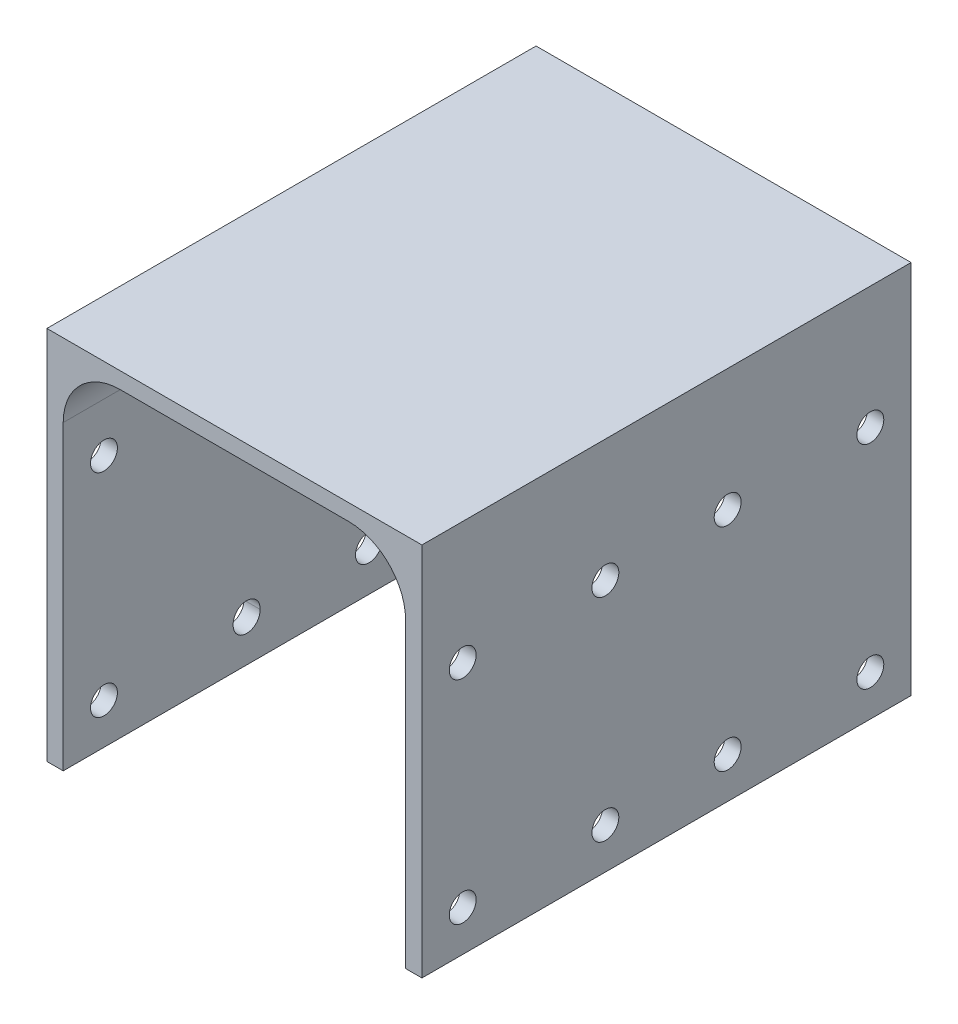
ISO-10303-21;
HEADER;
FILE_DESCRIPTION(('STEP AP214'),'2;1');
FILE_NAME('part.step','',(''),(''),'','','');
FILE_SCHEMA(('AUTOMOTIVE_DESIGN { 1 0 10303 214 1 1 1 1 }'));
ENDSEC;
DATA;
#1=APPLICATION_CONTEXT('core data for automotive mechanical design processes');
#2=APPLICATION_PROTOCOL_DEFINITION('international standard','automotive_design',2000,#1);
#3=PRODUCT_CONTEXT('',#1,'mechanical');
#4=PRODUCT('Part','Part','',(#3));
#5=PRODUCT_RELATED_PRODUCT_CATEGORY('part','',(#4));
#6=PRODUCT_DEFINITION_FORMATION('','',#4);
#7=PRODUCT_DEFINITION_CONTEXT('part definition',#1,'design');
#8=PRODUCT_DEFINITION('design','',#6,#7);
#9=PRODUCT_DEFINITION_SHAPE('','',#8);
#10=(LENGTH_UNIT() NAMED_UNIT(*) SI_UNIT(.MILLI.,.METRE.));
#11=(NAMED_UNIT(*) PLANE_ANGLE_UNIT() SI_UNIT($,.RADIAN.));
#12=(NAMED_UNIT(*) SI_UNIT($,.STERADIAN.) SOLID_ANGLE_UNIT());
#13=UNCERTAINTY_MEASURE_WITH_UNIT(LENGTH_MEASURE(1.E-05),#10,'distance_accuracy_value','');
#14=(GEOMETRIC_REPRESENTATION_CONTEXT(3) GLOBAL_UNCERTAINTY_ASSIGNED_CONTEXT((#13)) GLOBAL_UNIT_ASSIGNED_CONTEXT((#10,
#11,#12)) REPRESENTATION_CONTEXT('',''));
#15=CARTESIAN_POINT('',(0.,0.,0.));
#16=DIRECTION('',(0.,0.,1.));
#17=DIRECTION('',(1.,0.,0.));
#18=AXIS2_PLACEMENT_3D('',#15,#16,#17);
#19=CARTESIAN_POINT('',(0.,-23.,0.));
#20=DIRECTION('',(0.,-1.,0.));
#21=DIRECTION('',(0.,0.,-1.));
#22=AXIS2_PLACEMENT_3D('',#19,#20,#21);
#23=PLANE('',#22);
#24=DIRECTION('',(0.,0.,1.));
#25=VECTOR('',#24,1.);
#26=CARTESIAN_POINT('',(-21.,-23.,0.));
#27=LINE('',#26,#25);
#28=CARTESIAN_POINT('',(-21.,-23.,0.));
#29=VERTEX_POINT('',#28);
#30=CARTESIAN_POINT('',(-21.,-23.,60.));
#31=VERTEX_POINT('',#30);
#32=EDGE_CURVE('E171',#29,#31,#27,.T.);
#33=ORIENTED_EDGE('',*,*,#32,.T.);
#34=DIRECTION('',(-1.,0.,0.));
#35=VECTOR('',#34,1.);
#36=CARTESIAN_POINT('',(23.,-23.,60.));
#37=LINE('',#36,#35);
#38=CARTESIAN_POINT('',(-23.,-23.,60.));
#39=VERTEX_POINT('',#38);
#40=EDGE_CURVE('E205',#31,#39,#37,.T.);
#41=ORIENTED_EDGE('',*,*,#40,.T.);
#42=DIRECTION('',(0.,0.,-1.));
#43=VECTOR('',#42,1.);
#44=CARTESIAN_POINT('',(-23.,-23.,60.));
#45=LINE('',#44,#43);
#46=CARTESIAN_POINT('',(-23.,-23.,0.));
#47=VERTEX_POINT('',#46);
#48=EDGE_CURVE('E179',#39,#47,#45,.T.);
#49=ORIENTED_EDGE('',*,*,#48,.T.);
#50=DIRECTION('',(1.,0.,0.));
#51=VECTOR('',#50,1.);
#52=CARTESIAN_POINT('',(-23.,-23.,0.));
#53=LINE('',#52,#51);
#54=EDGE_CURVE('E199',#47,#29,#53,.T.);
#55=ORIENTED_EDGE('',*,*,#54,.T.);
#56=EDGE_LOOP('',(#33,#41,#49,#55));
#57=FACE_BOUND('',#56,.T.);
#58=ADVANCED_FACE('F38',(#57),#23,.T.);
#59=CARTESIAN_POINT('',(-23.,23.,60.));
#60=DIRECTION('',(-1.,0.,0.));
#61=DIRECTION('',(0.,0.,1.));
#62=AXIS2_PLACEMENT_3D('',#59,#60,#61);
#63=PLANE('',#62);
#64=CARTESIAN_POINT('',(-23.,-18.,37.5));
#65=DIRECTION('',(1.,0.,0.));
#66=DIRECTION('',(0.,0.,-1.));
#67=AXIS2_PLACEMENT_3D('',#64,#65,#66);
#68=CIRCLE('',#67,1.64999999999998);
#69=CARTESIAN_POINT('',(-23.,-17.9099122072001,39.1475388279456));
#70=VERTEX_POINT('',#69);
#71=CARTESIAN_POINT('',(-23.,-17.9099122072001,35.8524611720544));
#72=VERTEX_POINT('',#71);
#73=EDGE_CURVE('E128',#70,#72,#68,.T.);
#74=ORIENTED_EDGE('',*,*,#73,.T.);
#75=CARTESIAN_POINT('',(-23.,-17.8198244144,37.5));
#76=DIRECTION('',(-1.,0.,0.));
#77=DIRECTION('',(0.,0.,1.));
#78=AXIS2_PLACEMENT_3D('',#75,#76,#77);
#79=CIRCLE('',#78,1.64999999999999);
#80=EDGE_CURVE('E143',#70,#72,#79,.T.);
#81=ORIENTED_EDGE('',*,*,#80,.F.);
#82=EDGE_LOOP('',(#74,#81));
#83=FACE_BOUND('',#82,.T.);
#84=CARTESIAN_POINT('',(-23.,-18.,55.));
#85=DIRECTION('',(-1.,0.,0.));
#86=DIRECTION('',(0.,0.,1.));
#87=AXIS2_PLACEMENT_3D('',#84,#85,#86);
#88=CIRCLE('',#87,1.64999999999999);
#89=CARTESIAN_POINT('',(-23.,-18.,56.65));
#90=VERTEX_POINT('',#89);
#91=EDGE_CURVE('E397',#90,#90,#88,.T.);
#92=ORIENTED_EDGE('',*,*,#91,.F.);
#93=EDGE_LOOP('',(#92));
#94=FACE_BOUND('',#93,.T.);
#95=CARTESIAN_POINT('',(-23.,-18.,22.5));
#96=DIRECTION('',(-1.,0.,0.));
#97=DIRECTION('',(0.,0.,1.));
#98=AXIS2_PLACEMENT_3D('',#95,#96,#97);
#99=CIRCLE('',#98,1.64999999999999);
#100=CARTESIAN_POINT('',(-23.,-18.,24.15));
#101=VERTEX_POINT('',#100);
#102=EDGE_CURVE('E406',#101,#101,#99,.T.);
#103=ORIENTED_EDGE('',*,*,#102,.F.);
#104=EDGE_LOOP('',(#103));
#105=FACE_BOUND('',#104,.T.);
#106=CARTESIAN_POINT('',(-23.,8.,22.5));
#107=DIRECTION('',(-1.,0.,0.));
#108=DIRECTION('',(0.,0.,1.));
#109=AXIS2_PLACEMENT_3D('',#106,#107,#108);
#110=CIRCLE('',#109,1.64999999999999);
#111=CARTESIAN_POINT('',(-23.,8.,24.15));
#112=VERTEX_POINT('',#111);
#113=EDGE_CURVE('E412',#112,#112,#110,.T.);
#114=ORIENTED_EDGE('',*,*,#113,.F.);
#115=EDGE_LOOP('',(#114));
#116=FACE_BOUND('',#115,.T.);
#117=CARTESIAN_POINT('',(-23.,8.,55.));
#118=DIRECTION('',(-1.,0.,0.));
#119=DIRECTION('',(0.,0.,1.));
#120=AXIS2_PLACEMENT_3D('',#117,#118,#119);
#121=CIRCLE('',#120,1.64999999999999);
#122=CARTESIAN_POINT('',(-23.,8.,56.65));
#123=VERTEX_POINT('',#122);
#124=EDGE_CURVE('E418',#123,#123,#121,.T.);
#125=ORIENTED_EDGE('',*,*,#124,.F.);
#126=EDGE_LOOP('',(#125));
#127=FACE_BOUND('',#126,.T.);
#128=CARTESIAN_POINT('',(-23.,8.,5.));
#129=DIRECTION('',(-1.,0.,0.));
#130=DIRECTION('',(0.,0.,1.));
#131=AXIS2_PLACEMENT_3D('',#128,#129,#130);
#132=CIRCLE('',#131,1.64999999999999);
#133=CARTESIAN_POINT('',(-23.,8.,6.64999999999999));
#134=VERTEX_POINT('',#133);
#135=EDGE_CURVE('E424',#134,#134,#132,.T.);
#136=ORIENTED_EDGE('',*,*,#135,.F.);
#137=EDGE_LOOP('',(#136));
#138=FACE_BOUND('',#137,.T.);
#139=CARTESIAN_POINT('',(-23.,8.,37.5));
#140=DIRECTION('',(-1.,0.,0.));
#141=DIRECTION('',(0.,0.,1.));
#142=AXIS2_PLACEMENT_3D('',#139,#140,#141);
#143=CIRCLE('',#142,1.64999999999999);
#144=CARTESIAN_POINT('',(-23.,8.,39.15));
#145=VERTEX_POINT('',#144);
#146=EDGE_CURVE('E153',#145,#145,#143,.T.);
#147=ORIENTED_EDGE('',*,*,#146,.F.);
#148=EDGE_LOOP('',(#147));
#149=FACE_BOUND('',#148,.T.);
#150=CARTESIAN_POINT('',(-23.,-18.,5.));
#151=DIRECTION('',(-1.,0.,0.));
#152=DIRECTION('',(0.,0.,1.));
#153=AXIS2_PLACEMENT_3D('',#150,#151,#152);
#154=CIRCLE('',#153,1.64999999999999);
#155=CARTESIAN_POINT('',(-23.,-18.,6.64999999999999));
#156=VERTEX_POINT('',#155);
#157=EDGE_CURVE('E150',#156,#156,#154,.T.);
#158=ORIENTED_EDGE('',*,*,#157,.F.);
#159=EDGE_LOOP('',(#158));
#160=FACE_BOUND('',#159,.T.);
#161=ORIENTED_EDGE('',*,*,#48,.F.);
#162=DIRECTION('',(0.,-1.,0.));
#163=VECTOR('',#162,1.);
#164=CARTESIAN_POINT('',(-23.,23.,60.));
#165=LINE('',#164,#163);
#166=CARTESIAN_POINT('',(-23.,23.,60.));
#167=VERTEX_POINT('',#166);
#168=EDGE_CURVE('E137',#167,#39,#165,.T.);
#169=ORIENTED_EDGE('',*,*,#168,.F.);
#170=DIRECTION('',(0.,0.,-1.));
#171=VECTOR('',#170,1.);
#172=CARTESIAN_POINT('',(-23.,23.,60.));
#173=LINE('',#172,#171);
#174=CARTESIAN_POINT('',(-23.,23.,0.));
#175=VERTEX_POINT('',#174);
#176=EDGE_CURVE('E182',#167,#175,#173,.T.);
#177=ORIENTED_EDGE('',*,*,#176,.T.);
#178=DIRECTION('',(0.,-1.,0.));
#179=VECTOR('',#178,1.);
#180=CARTESIAN_POINT('',(-23.,23.,0.));
#181=LINE('',#180,#179);
#182=EDGE_CURVE('E195',#175,#47,#181,.T.);
#183=ORIENTED_EDGE('',*,*,#182,.T.);
#184=EDGE_LOOP('',(#161,#169,#177,#183));
#185=FACE_BOUND('',#184,.T.);
#186=ADVANCED_FACE('F141',(#83,#94,#105,#116,#127,#138,#149,#160,#185),#63,.T.);
#187=CARTESIAN_POINT('',(23.,23.,60.));
#188=DIRECTION('',(0.,0.,1.));
#189=DIRECTION('',(1.,0.,0.));
#190=AXIS2_PLACEMENT_3D('',#187,#188,#189);
#191=PLANE('',#190);
#192=DIRECTION('',(0.,-1.,0.));
#193=VECTOR('',#192,1.);
#194=CARTESIAN_POINT('',(-21.,21.,60.));
#195=LINE('',#194,#193);
#196=CARTESIAN_POINT('',(-21.,14.,60.));
#197=VERTEX_POINT('',#196);
#198=EDGE_CURVE('E162',#197,#31,#195,.T.);
#199=ORIENTED_EDGE('',*,*,#198,.F.);
#200=CARTESIAN_POINT('',(-14.,14.,60.));
#201=DIRECTION('',(0.,0.,1.));
#202=DIRECTION('',(1.,0.,0.));
#203=AXIS2_PLACEMENT_3D('',#200,#201,#202);
#204=CIRCLE('',#203,7.);
#205=CARTESIAN_POINT('',(-14.,21.,60.));
#206=VERTEX_POINT('',#205);
#207=EDGE_CURVE('E235',#197,#206,#204,.F.);
#208=ORIENTED_EDGE('',*,*,#207,.T.);
#209=DIRECTION('',(-1.,0.,0.));
#210=VECTOR('',#209,1.);
#211=CARTESIAN_POINT('',(21.,21.,60.));
#212=LINE('',#211,#210);
#213=CARTESIAN_POINT('',(14.,21.,60.));
#214=VERTEX_POINT('',#213);
#215=EDGE_CURVE('E166',#214,#206,#212,.T.);
#216=ORIENTED_EDGE('',*,*,#215,.F.);
#217=CARTESIAN_POINT('',(14.,14.,60.));
#218=DIRECTION('',(0.,0.,1.));
#219=DIRECTION('',(1.,0.,0.));
#220=AXIS2_PLACEMENT_3D('',#217,#218,#219);
#221=CIRCLE('',#220,7.);
#222=CARTESIAN_POINT('',(21.,14.,60.));
#223=VERTEX_POINT('',#222);
#224=EDGE_CURVE('E46',#214,#223,#221,.F.);
#225=ORIENTED_EDGE('',*,*,#224,.T.);
#226=DIRECTION('',(0.,1.,0.));
#227=VECTOR('',#226,1.);
#228=CARTESIAN_POINT('',(21.,-23.,60.));
#229=LINE('',#228,#227);
#230=CARTESIAN_POINT('',(21.,-23.,60.));
#231=VERTEX_POINT('',#230);
#232=EDGE_CURVE('E173',#231,#223,#229,.T.);
#233=ORIENTED_EDGE('',*,*,#232,.F.);
#234=CARTESIAN_POINT('',(23.,-23.,60.));
#235=VERTEX_POINT('',#234);
#236=EDGE_CURVE('E186',#235,#231,#37,.T.);
#237=ORIENTED_EDGE('',*,*,#236,.F.);
#238=DIRECTION('',(0.,-1.,0.));
#239=VECTOR('',#238,1.);
#240=CARTESIAN_POINT('',(23.,23.,60.));
#241=LINE('',#240,#239);
#242=CARTESIAN_POINT('',(23.,23.,60.));
#243=VERTEX_POINT('',#242);
#244=EDGE_CURVE('E210',#243,#235,#241,.T.);
#245=ORIENTED_EDGE('',*,*,#244,.F.);
#246=DIRECTION('',(-1.,0.,0.));
#247=VECTOR('',#246,1.);
#248=CARTESIAN_POINT('',(23.,23.,60.));
#249=LINE('',#248,#247);
#250=EDGE_CURVE('E192',#243,#167,#249,.T.);
#251=ORIENTED_EDGE('',*,*,#250,.T.);
#252=ORIENTED_EDGE('',*,*,#168,.T.);
#253=ORIENTED_EDGE('',*,*,#40,.F.);
#254=EDGE_LOOP('',(#199,#208,#216,#225,#233,#237,#245,#251,#252,#253));
#255=FACE_BOUND('',#254,.T.);
#256=ADVANCED_FACE('F252',(#255),#191,.T.);
#257=CARTESIAN_POINT('',(23.,23.,0.));
#258=DIRECTION('',(1.,0.,0.));
#259=DIRECTION('',(0.,0.,-1.));
#260=AXIS2_PLACEMENT_3D('',#257,#258,#259);
#261=PLANE('',#260);
#262=CARTESIAN_POINT('',(23.,8.,55.));
#263=DIRECTION('',(1.,0.,0.));
#264=DIRECTION('',(0.,0.,-1.));
#265=AXIS2_PLACEMENT_3D('',#262,#263,#264);
#266=CIRCLE('',#265,1.64999999999999);
#267=CARTESIAN_POINT('',(23.,8.,53.35));
#268=VERTEX_POINT('',#267);
#269=EDGE_CURVE('E226',#268,#268,#266,.T.);
#270=ORIENTED_EDGE('',*,*,#269,.F.);
#271=EDGE_LOOP('',(#270));
#272=FACE_BOUND('',#271,.T.);
#273=CARTESIAN_POINT('',(23.,8.,22.5));
#274=DIRECTION('',(1.,0.,0.));
#275=DIRECTION('',(0.,0.,-1.));
#276=AXIS2_PLACEMENT_3D('',#273,#274,#275);
#277=CIRCLE('',#276,1.64999999999999);
#278=CARTESIAN_POINT('',(23.,8.,20.85));
#279=VERTEX_POINT('',#278);
#280=EDGE_CURVE('E225',#279,#279,#277,.T.);
#281=ORIENTED_EDGE('',*,*,#280,.F.);
#282=EDGE_LOOP('',(#281));
#283=FACE_BOUND('',#282,.T.);
#284=CARTESIAN_POINT('',(23.,-18.,22.5));
#285=DIRECTION('',(1.,0.,0.));
#286=DIRECTION('',(0.,0.,-1.));
#287=AXIS2_PLACEMENT_3D('',#284,#285,#286);
#288=CIRCLE('',#287,1.64999999999999);
#289=CARTESIAN_POINT('',(23.,-18.,20.85));
#290=VERTEX_POINT('',#289);
#291=EDGE_CURVE('E482',#290,#290,#288,.T.);
#292=ORIENTED_EDGE('',*,*,#291,.F.);
#293=EDGE_LOOP('',(#292));
#294=FACE_BOUND('',#293,.T.);
#295=CARTESIAN_POINT('',(23.,-18.,55.));
#296=DIRECTION('',(1.,0.,0.));
#297=DIRECTION('',(0.,0.,-1.));
#298=AXIS2_PLACEMENT_3D('',#295,#296,#297);
#299=CIRCLE('',#298,1.64999999999999);
#300=CARTESIAN_POINT('',(23.,-18.,53.35));
#301=VERTEX_POINT('',#300);
#302=EDGE_CURVE('E478',#301,#301,#299,.T.);
#303=ORIENTED_EDGE('',*,*,#302,.F.);
#304=EDGE_LOOP('',(#303));
#305=FACE_BOUND('',#304,.T.);
#306=CARTESIAN_POINT('',(23.,-18.,5.));
#307=DIRECTION('',(1.,0.,0.));
#308=DIRECTION('',(0.,0.,-1.));
#309=AXIS2_PLACEMENT_3D('',#306,#307,#308);
#310=CIRCLE('',#309,1.64999999999999);
#311=CARTESIAN_POINT('',(23.,-18.,3.35000000000001));
#312=VERTEX_POINT('',#311);
#313=EDGE_CURVE('E474',#312,#312,#310,.T.);
#314=ORIENTED_EDGE('',*,*,#313,.F.);
#315=EDGE_LOOP('',(#314));
#316=FACE_BOUND('',#315,.T.);
#317=CARTESIAN_POINT('',(23.,8.,5.));
#318=DIRECTION('',(1.,0.,0.));
#319=DIRECTION('',(0.,0.,-1.));
#320=AXIS2_PLACEMENT_3D('',#317,#318,#319);
#321=CIRCLE('',#320,1.64999999999999);
#322=CARTESIAN_POINT('',(23.,8.,3.35000000000001));
#323=VERTEX_POINT('',#322);
#324=EDGE_CURVE('E470',#323,#323,#321,.T.);
#325=ORIENTED_EDGE('',*,*,#324,.F.);
#326=EDGE_LOOP('',(#325));
#327=FACE_BOUND('',#326,.T.);
#328=CARTESIAN_POINT('',(23.,8.,37.5));
#329=DIRECTION('',(1.,0.,0.));
#330=DIRECTION('',(0.,0.,-1.));
#331=AXIS2_PLACEMENT_3D('',#328,#329,#330);
#332=CIRCLE('',#331,1.64999999999999);
#333=CARTESIAN_POINT('',(23.,8.,35.85));
#334=VERTEX_POINT('',#333);
#335=EDGE_CURVE('E221',#334,#334,#332,.T.);
#336=ORIENTED_EDGE('',*,*,#335,.F.);
#337=EDGE_LOOP('',(#336));
#338=FACE_BOUND('',#337,.T.);
#339=CARTESIAN_POINT('',(23.,-18.,37.5));
#340=DIRECTION('',(1.,0.,0.));
#341=DIRECTION('',(0.,0.,-1.));
#342=AXIS2_PLACEMENT_3D('',#339,#340,#341);
#343=CIRCLE('',#342,1.64999999999999);
#344=CARTESIAN_POINT('',(23.,-18.,35.85));
#345=VERTEX_POINT('',#344);
#346=EDGE_CURVE('E144',#345,#345,#343,.T.);
#347=ORIENTED_EDGE('',*,*,#346,.F.);
#348=EDGE_LOOP('',(#347));
#349=FACE_BOUND('',#348,.T.);
#350=DIRECTION('',(0.,0.,1.));
#351=VECTOR('',#350,1.);
#352=CARTESIAN_POINT('',(23.,-23.,0.));
#353=LINE('',#352,#351);
#354=CARTESIAN_POINT('',(23.,-23.,0.));
#355=VERTEX_POINT('',#354);
#356=EDGE_CURVE('E202',#355,#235,#353,.T.);
#357=ORIENTED_EDGE('',*,*,#356,.F.);
#358=DIRECTION('',(0.,-1.,0.));
#359=VECTOR('',#358,1.);
#360=CARTESIAN_POINT('',(23.,23.,0.));
#361=LINE('',#360,#359);
#362=CARTESIAN_POINT('',(23.,23.,0.));
#363=VERTEX_POINT('',#362);
#364=EDGE_CURVE('E212',#363,#355,#361,.T.);
#365=ORIENTED_EDGE('',*,*,#364,.F.);
#366=DIRECTION('',(0.,0.,1.));
#367=VECTOR('',#366,1.);
#368=CARTESIAN_POINT('',(23.,23.,0.));
#369=LINE('',#368,#367);
#370=EDGE_CURVE('E189',#363,#243,#369,.T.);
#371=ORIENTED_EDGE('',*,*,#370,.T.);
#372=ORIENTED_EDGE('',*,*,#244,.T.);
#373=EDGE_LOOP('',(#357,#365,#371,#372));
#374=FACE_BOUND('',#373,.T.);
#375=ADVANCED_FACE('F269',(#272,#283,#294,#305,#316,#327,#338,#349,#374),#261,.T.);
#376=CARTESIAN_POINT('',(-23.,23.,0.));
#377=DIRECTION('',(0.,0.,-1.));
#378=DIRECTION('',(-1.,0.,0.));
#379=AXIS2_PLACEMENT_3D('',#376,#377,#378);
#380=PLANE('',#379);
#381=DIRECTION('',(-1.,0.,0.));
#382=VECTOR('',#381,1.);
#383=CARTESIAN_POINT('',(21.,21.,0.));
#384=LINE('',#383,#382);
#385=CARTESIAN_POINT('',(14.,21.,0.));
#386=VERTEX_POINT('',#385);
#387=CARTESIAN_POINT('',(-14.,21.,0.));
#388=VERTEX_POINT('',#387);
#389=EDGE_CURVE('E168',#386,#388,#384,.T.);
#390=ORIENTED_EDGE('',*,*,#389,.T.);
#391=CARTESIAN_POINT('',(-14.,14.,0.));
#392=DIRECTION('',(0.,0.,-1.));
#393=DIRECTION('',(-1.,0.,0.));
#394=AXIS2_PLACEMENT_3D('',#391,#392,#393);
#395=CIRCLE('',#394,7.);
#396=CARTESIAN_POINT('',(-21.,14.,0.));
#397=VERTEX_POINT('',#396);
#398=EDGE_CURVE('E237',#388,#397,#395,.F.);
#399=ORIENTED_EDGE('',*,*,#398,.T.);
#400=DIRECTION('',(0.,-1.,0.));
#401=VECTOR('',#400,1.);
#402=CARTESIAN_POINT('',(-21.,21.,0.));
#403=LINE('',#402,#401);
#404=EDGE_CURVE('E163',#397,#29,#403,.T.);
#405=ORIENTED_EDGE('',*,*,#404,.T.);
#406=ORIENTED_EDGE('',*,*,#54,.F.);
#407=ORIENTED_EDGE('',*,*,#182,.F.);
#408=DIRECTION('',(1.,0.,0.));
#409=VECTOR('',#408,1.);
#410=CARTESIAN_POINT('',(-23.,23.,0.));
#411=LINE('',#410,#409);
#412=EDGE_CURVE('E185',#175,#363,#411,.T.);
#413=ORIENTED_EDGE('',*,*,#412,.T.);
#414=ORIENTED_EDGE('',*,*,#364,.T.);
#415=CARTESIAN_POINT('',(21.,-23.,0.));
#416=VERTEX_POINT('',#415);
#417=EDGE_CURVE('E198',#416,#355,#53,.T.);
#418=ORIENTED_EDGE('',*,*,#417,.F.);
#419=DIRECTION('',(0.,1.,0.));
#420=VECTOR('',#419,1.);
#421=CARTESIAN_POINT('',(21.,-23.,0.));
#422=LINE('',#421,#420);
#423=CARTESIAN_POINT('',(21.,14.,0.));
#424=VERTEX_POINT('',#423);
#425=EDGE_CURVE('E165',#416,#424,#422,.T.);
#426=ORIENTED_EDGE('',*,*,#425,.T.);
#427=CARTESIAN_POINT('',(14.,14.,0.));
#428=DIRECTION('',(0.,0.,-1.));
#429=DIRECTION('',(-1.,0.,0.));
#430=AXIS2_PLACEMENT_3D('',#427,#428,#429);
#431=CIRCLE('',#430,7.);
#432=EDGE_CURVE('E11',#424,#386,#431,.F.);
#433=ORIENTED_EDGE('',*,*,#432,.T.);
#434=EDGE_LOOP('',(#390,#399,#405,#406,#407,#413,#414,#418,#426,#433));
#435=FACE_BOUND('',#434,.T.);
#436=ADVANCED_FACE('F241',(#435),#380,.T.);
#437=CARTESIAN_POINT('',(0.,23.,0.));
#438=DIRECTION('',(0.,-1.,0.));
#439=DIRECTION('',(0.,0.,-1.));
#440=AXIS2_PLACEMENT_3D('',#437,#438,#439);
#441=PLANE('',#440);
#442=ORIENTED_EDGE('',*,*,#176,.F.);
#443=ORIENTED_EDGE('',*,*,#250,.F.);
#444=ORIENTED_EDGE('',*,*,#370,.F.);
#445=ORIENTED_EDGE('',*,*,#412,.F.);
#446=EDGE_LOOP('',(#442,#443,#444,#445));
#447=FACE_BOUND('',#446,.T.);
#448=ADVANCED_FACE('F273',(#447),#441,.F.);
#449=DIRECTION('',(0.,0.,1.));
#450=VECTOR('',#449,1.);
#451=CARTESIAN_POINT('',(21.,-23.,0.));
#452=LINE('',#451,#450);
#453=EDGE_CURVE('E177',#416,#231,#452,.T.);
#454=ORIENTED_EDGE('',*,*,#453,.F.);
#455=ORIENTED_EDGE('',*,*,#417,.T.);
#456=ORIENTED_EDGE('',*,*,#356,.T.);
#457=ORIENTED_EDGE('',*,*,#236,.T.);
#458=EDGE_LOOP('',(#454,#455,#456,#457));
#459=FACE_BOUND('',#458,.T.);
#460=ADVANCED_FACE('F263',(#459),#23,.T.);
#461=CARTESIAN_POINT('',(-21.,21.,0.));
#462=DIRECTION('',(-1.,0.,0.));
#463=DIRECTION('',(0.,0.,1.));
#464=AXIS2_PLACEMENT_3D('',#461,#462,#463);
#465=PLANE('',#464);
#466=CARTESIAN_POINT('',(-21.,-18.,55.));
#467=DIRECTION('',(-1.,0.,0.));
#468=DIRECTION('',(0.,0.,1.));
#469=AXIS2_PLACEMENT_3D('',#466,#467,#468);
#470=CIRCLE('',#469,1.64999999999999);
#471=CARTESIAN_POINT('',(-21.,-18.,56.65));
#472=VERTEX_POINT('',#471);
#473=EDGE_CURVE('E400',#472,#472,#470,.T.);
#474=ORIENTED_EDGE('',*,*,#473,.T.);
#475=EDGE_LOOP('',(#474));
#476=FACE_BOUND('',#475,.T.);
#477=CARTESIAN_POINT('',(-21.,-18.,22.5));
#478=DIRECTION('',(-1.,0.,0.));
#479=DIRECTION('',(0.,0.,1.));
#480=AXIS2_PLACEMENT_3D('',#477,#478,#479);
#481=CIRCLE('',#480,1.64999999999999);
#482=CARTESIAN_POINT('',(-21.,-18.,24.15));
#483=VERTEX_POINT('',#482);
#484=EDGE_CURVE('E409',#483,#483,#481,.T.);
#485=ORIENTED_EDGE('',*,*,#484,.T.);
#486=EDGE_LOOP('',(#485));
#487=FACE_BOUND('',#486,.T.);
#488=CARTESIAN_POINT('',(-21.,8.,22.5));
#489=DIRECTION('',(-1.,0.,0.));
#490=DIRECTION('',(0.,0.,1.));
#491=AXIS2_PLACEMENT_3D('',#488,#489,#490);
#492=CIRCLE('',#491,1.64999999999999);
#493=CARTESIAN_POINT('',(-21.,8.,24.15));
#494=VERTEX_POINT('',#493);
#495=EDGE_CURVE('E415',#494,#494,#492,.T.);
#496=ORIENTED_EDGE('',*,*,#495,.T.);
#497=EDGE_LOOP('',(#496));
#498=FACE_BOUND('',#497,.T.);
#499=CARTESIAN_POINT('',(-21.,8.,55.));
#500=DIRECTION('',(-1.,0.,0.));
#501=DIRECTION('',(0.,0.,1.));
#502=AXIS2_PLACEMENT_3D('',#499,#500,#501);
#503=CIRCLE('',#502,1.64999999999999);
#504=CARTESIAN_POINT('',(-21.,8.,56.65));
#505=VERTEX_POINT('',#504);
#506=EDGE_CURVE('E421',#505,#505,#503,.T.);
#507=ORIENTED_EDGE('',*,*,#506,.T.);
#508=EDGE_LOOP('',(#507));
#509=FACE_BOUND('',#508,.T.);
#510=CARTESIAN_POINT('',(-21.,8.,5.));
#511=DIRECTION('',(-1.,0.,0.));
#512=DIRECTION('',(0.,0.,1.));
#513=AXIS2_PLACEMENT_3D('',#510,#511,#512);
#514=CIRCLE('',#513,1.64999999999999);
#515=CARTESIAN_POINT('',(-21.,8.,6.64999999999999));
#516=VERTEX_POINT('',#515);
#517=EDGE_CURVE('E427',#516,#516,#514,.T.);
#518=ORIENTED_EDGE('',*,*,#517,.T.);
#519=EDGE_LOOP('',(#518));
#520=FACE_BOUND('',#519,.T.);
#521=CARTESIAN_POINT('',(-21.,8.,37.5));
#522=DIRECTION('',(-1.,0.,0.));
#523=DIRECTION('',(0.,0.,1.));
#524=AXIS2_PLACEMENT_3D('',#521,#522,#523);
#525=CIRCLE('',#524,1.64999999999999);
#526=CARTESIAN_POINT('',(-21.,8.,39.15));
#527=VERTEX_POINT('',#526);
#528=EDGE_CURVE('E148',#527,#527,#525,.T.);
#529=ORIENTED_EDGE('',*,*,#528,.T.);
#530=EDGE_LOOP('',(#529));
#531=FACE_BOUND('',#530,.T.);
#532=CARTESIAN_POINT('',(-21.,-17.8198244144,37.5));
#533=DIRECTION('',(-1.,0.,0.));
#534=DIRECTION('',(0.,0.,1.));
#535=AXIS2_PLACEMENT_3D('',#532,#533,#534);
#536=CIRCLE('',#535,1.64999999999999);
#537=CARTESIAN_POINT('',(-21.,-17.9099122072001,39.1475388279456));
#538=VERTEX_POINT('',#537);
#539=CARTESIAN_POINT('',(-21.,-17.9099122072001,35.8524611720544));
#540=VERTEX_POINT('',#539);
#541=EDGE_CURVE('E147',#538,#540,#536,.T.);
#542=ORIENTED_EDGE('',*,*,#541,.T.);
#543=CARTESIAN_POINT('',(-21.,-18.,37.5));
#544=DIRECTION('',(-1.,0.,0.));
#545=DIRECTION('',(0.,0.,1.));
#546=AXIS2_PLACEMENT_3D('',#543,#544,#545);
#547=CIRCLE('',#546,1.64999999999998);
#548=EDGE_CURVE('E131',#540,#538,#547,.T.);
#549=ORIENTED_EDGE('',*,*,#548,.T.);
#550=EDGE_LOOP('',(#542,#549));
#551=FACE_BOUND('',#550,.T.);
#552=CARTESIAN_POINT('',(-21.,-18.,5.));
#553=DIRECTION('',(-1.,0.,0.));
#554=DIRECTION('',(0.,0.,1.));
#555=AXIS2_PLACEMENT_3D('',#552,#553,#554);
#556=CIRCLE('',#555,1.64999999999999);
#557=CARTESIAN_POINT('',(-21.,-18.,6.64999999999999));
#558=VERTEX_POINT('',#557);
#559=EDGE_CURVE('E159',#558,#558,#556,.T.);
#560=ORIENTED_EDGE('',*,*,#559,.T.);
#561=EDGE_LOOP('',(#560));
#562=FACE_BOUND('',#561,.T.);
#563=ORIENTED_EDGE('',*,*,#404,.F.);
#564=DIRECTION('',(0.,0.,1.));
#565=VECTOR('',#564,1.);
#566=CARTESIAN_POINT('',(-21.,14.,60.));
#567=LINE('',#566,#565);
#568=EDGE_CURVE('E217',#397,#197,#567,.T.);
#569=ORIENTED_EDGE('',*,*,#568,.T.);
#570=ORIENTED_EDGE('',*,*,#198,.T.);
#571=ORIENTED_EDGE('',*,*,#32,.F.);
#572=EDGE_LOOP('',(#563,#569,#570,#571));
#573=FACE_BOUND('',#572,.T.);
#574=ADVANCED_FACE('F249',(#476,#487,#498,#509,#520,#531,#551,#562,#573),#465,.F.);
#575=CARTESIAN_POINT('',(21.,21.,0.));
#576=DIRECTION('',(0.,1.,0.));
#577=DIRECTION('',(-1.,0.,0.));
#578=AXIS2_PLACEMENT_3D('',#575,#576,#577);
#579=PLANE('',#578);
#580=ORIENTED_EDGE('',*,*,#215,.T.);
#581=DIRECTION('',(0.,0.,1.));
#582=VECTOR('',#581,1.);
#583=CARTESIAN_POINT('',(-14.,21.,0.));
#584=LINE('',#583,#582);
#585=EDGE_CURVE('E232',#206,#388,#584,.F.);
#586=ORIENTED_EDGE('',*,*,#585,.T.);
#587=ORIENTED_EDGE('',*,*,#389,.F.);
#588=DIRECTION('',(0.,0.,1.));
#589=VECTOR('',#588,1.);
#590=CARTESIAN_POINT('',(14.,21.,60.));
#591=LINE('',#590,#589);
#592=EDGE_CURVE('E229',#386,#214,#591,.T.);
#593=ORIENTED_EDGE('',*,*,#592,.T.);
#594=EDGE_LOOP('',(#580,#586,#587,#593));
#595=FACE_BOUND('',#594,.T.);
#596=ADVANCED_FACE('F255',(#595),#579,.F.);
#597=CARTESIAN_POINT('',(21.,-23.,0.));
#598=DIRECTION('',(1.,0.,0.));
#599=DIRECTION('',(0.,0.,-1.));
#600=AXIS2_PLACEMENT_3D('',#597,#598,#599);
#601=PLANE('',#600);
#602=CARTESIAN_POINT('',(21.,8.,55.));
#603=DIRECTION('',(1.,0.,0.));
#604=DIRECTION('',(0.,0.,-1.));
#605=AXIS2_PLACEMENT_3D('',#602,#603,#604);
#606=CIRCLE('',#605,1.64999999999998);
#607=CARTESIAN_POINT('',(21.,8.,53.35));
#608=VERTEX_POINT('',#607);
#609=EDGE_CURVE('E222',#608,#608,#606,.T.);
#610=ORIENTED_EDGE('',*,*,#609,.T.);
#611=EDGE_LOOP('',(#610));
#612=FACE_BOUND('',#611,.T.);
#613=CARTESIAN_POINT('',(21.,8.,22.5));
#614=DIRECTION('',(1.,0.,0.));
#615=DIRECTION('',(0.,0.,-1.));
#616=AXIS2_PLACEMENT_3D('',#613,#614,#615);
#617=CIRCLE('',#616,1.64999999999998);
#618=CARTESIAN_POINT('',(21.,8.,20.85));
#619=VERTEX_POINT('',#618);
#620=EDGE_CURVE('E374',#619,#619,#617,.T.);
#621=ORIENTED_EDGE('',*,*,#620,.T.);
#622=EDGE_LOOP('',(#621));
#623=FACE_BOUND('',#622,.T.);
#624=CARTESIAN_POINT('',(21.,-18.,22.5));
#625=DIRECTION('',(1.,0.,0.));
#626=DIRECTION('',(0.,0.,-1.));
#627=AXIS2_PLACEMENT_3D('',#624,#625,#626);
#628=CIRCLE('',#627,1.64999999999998);
#629=CARTESIAN_POINT('',(21.,-18.,20.85));
#630=VERTEX_POINT('',#629);
#631=EDGE_CURVE('E378',#630,#630,#628,.T.);
#632=ORIENTED_EDGE('',*,*,#631,.T.);
#633=EDGE_LOOP('',(#632));
#634=FACE_BOUND('',#633,.T.);
#635=CARTESIAN_POINT('',(21.,-18.,55.));
#636=DIRECTION('',(1.,0.,0.));
#637=DIRECTION('',(0.,0.,-1.));
#638=AXIS2_PLACEMENT_3D('',#635,#636,#637);
#639=CIRCLE('',#638,1.64999999999998);
#640=CARTESIAN_POINT('',(21.,-18.,53.35));
#641=VERTEX_POINT('',#640);
#642=EDGE_CURVE('E382',#641,#641,#639,.T.);
#643=ORIENTED_EDGE('',*,*,#642,.T.);
#644=EDGE_LOOP('',(#643));
#645=FACE_BOUND('',#644,.T.);
#646=CARTESIAN_POINT('',(21.,-18.,5.));
#647=DIRECTION('',(1.,0.,0.));
#648=DIRECTION('',(0.,0.,-1.));
#649=AXIS2_PLACEMENT_3D('',#646,#647,#648);
#650=CIRCLE('',#649,1.64999999999998);
#651=CARTESIAN_POINT('',(21.,-18.,3.35000000000002));
#652=VERTEX_POINT('',#651);
#653=EDGE_CURVE('E386',#652,#652,#650,.T.);
#654=ORIENTED_EDGE('',*,*,#653,.T.);
#655=EDGE_LOOP('',(#654));
#656=FACE_BOUND('',#655,.T.);
#657=CARTESIAN_POINT('',(21.,8.,5.));
#658=DIRECTION('',(1.,0.,0.));
#659=DIRECTION('',(0.,0.,-1.));
#660=AXIS2_PLACEMENT_3D('',#657,#658,#659);
#661=CIRCLE('',#660,1.64999999999998);
#662=CARTESIAN_POINT('',(21.,8.,3.35000000000002));
#663=VERTEX_POINT('',#662);
#664=EDGE_CURVE('E390',#663,#663,#661,.T.);
#665=ORIENTED_EDGE('',*,*,#664,.T.);
#666=EDGE_LOOP('',(#665));
#667=FACE_BOUND('',#666,.T.);
#668=CARTESIAN_POINT('',(21.,8.,37.5));
#669=DIRECTION('',(1.,0.,0.));
#670=DIRECTION('',(0.,0.,-1.));
#671=AXIS2_PLACEMENT_3D('',#668,#669,#670);
#672=CIRCLE('',#671,1.64999999999998);
#673=CARTESIAN_POINT('',(21.,8.,35.85));
#674=VERTEX_POINT('',#673);
#675=EDGE_CURVE('E218',#674,#674,#672,.T.);
#676=ORIENTED_EDGE('',*,*,#675,.T.);
#677=EDGE_LOOP('',(#676));
#678=FACE_BOUND('',#677,.T.);
#679=CARTESIAN_POINT('',(21.,-18.,37.5));
#680=DIRECTION('',(1.,0.,0.));
#681=DIRECTION('',(0.,0.,-1.));
#682=AXIS2_PLACEMENT_3D('',#679,#680,#681);
#683=CIRCLE('',#682,1.64999999999998);
#684=CARTESIAN_POINT('',(21.,-18.,35.85));
#685=VERTEX_POINT('',#684);
#686=EDGE_CURVE('E395',#685,#685,#683,.T.);
#687=ORIENTED_EDGE('',*,*,#686,.T.);
#688=EDGE_LOOP('',(#687));
#689=FACE_BOUND('',#688,.T.);
#690=ORIENTED_EDGE('',*,*,#232,.T.);
#691=DIRECTION('',(0.,0.,1.));
#692=VECTOR('',#691,1.);
#693=CARTESIAN_POINT('',(21.,14.,0.));
#694=LINE('',#693,#692);
#695=EDGE_CURVE('E53',#223,#424,#694,.F.);
#696=ORIENTED_EDGE('',*,*,#695,.T.);
#697=ORIENTED_EDGE('',*,*,#425,.F.);
#698=ORIENTED_EDGE('',*,*,#453,.T.);
#699=EDGE_LOOP('',(#690,#696,#697,#698));
#700=FACE_BOUND('',#699,.T.);
#701=ADVANCED_FACE('F261',(#612,#623,#634,#645,#656,#667,#678,#689,#700),#601,.F.);
#702=CARTESIAN_POINT('',(-23.,-18.,5.));
#703=DIRECTION('',(-1.,0.,0.));
#704=DIRECTION('',(0.,0.,1.));
#705=AXIS2_PLACEMENT_3D('',#702,#703,#704);
#706=CYLINDRICAL_SURFACE('',#705,1.64999999999999);
#707=ORIENTED_EDGE('',*,*,#559,.F.);
#708=EDGE_LOOP('',(#707));
#709=FACE_BOUND('',#708,.T.);
#710=ORIENTED_EDGE('',*,*,#157,.T.);
#711=EDGE_LOOP('',(#710));
#712=FACE_BOUND('',#711,.T.);
#713=ADVANCED_FACE('F299',(#709,#712),#706,.F.);
#714=CARTESIAN_POINT('',(-23.,-17.8198244144,37.5));
#715=DIRECTION('',(-1.,0.,0.));
#716=DIRECTION('',(0.,0.,1.));
#717=AXIS2_PLACEMENT_3D('',#714,#715,#716);
#718=CYLINDRICAL_SURFACE('',#717,1.64999999999999);
#719=ORIENTED_EDGE('',*,*,#541,.F.);
#720=DIRECTION('',(1.,0.,0.));
#721=VECTOR('',#720,1.);
#722=CARTESIAN_POINT('',(0.,-17.9099122072001,39.1475388279456));
#723=LINE('',#722,#721);
#724=EDGE_CURVE('E136',#538,#70,#723,.F.);
#725=ORIENTED_EDGE('',*,*,#724,.T.);
#726=ORIENTED_EDGE('',*,*,#80,.T.);
#727=DIRECTION('',(1.,0.,0.));
#728=VECTOR('',#727,1.);
#729=CARTESIAN_POINT('',(0.,-17.9099122072001,35.8524611720544));
#730=LINE('',#729,#728);
#731=EDGE_CURVE('E125',#72,#540,#730,.T.);
#732=ORIENTED_EDGE('',*,*,#731,.T.);
#733=EDGE_LOOP('',(#719,#725,#726,#732));
#734=FACE_BOUND('',#733,.T.);
#735=ADVANCED_FACE('F146',(#734),#718,.F.);
#736=CARTESIAN_POINT('',(-23.,8.,37.5));
#737=DIRECTION('',(-1.,0.,0.));
#738=DIRECTION('',(0.,0.,1.));
#739=AXIS2_PLACEMENT_3D('',#736,#737,#738);
#740=CYLINDRICAL_SURFACE('',#739,1.64999999999999);
#741=ORIENTED_EDGE('',*,*,#528,.F.);
#742=EDGE_LOOP('',(#741));
#743=FACE_BOUND('',#742,.T.);
#744=ORIENTED_EDGE('',*,*,#146,.T.);
#745=EDGE_LOOP('',(#744));
#746=FACE_BOUND('',#745,.T.);
#747=ADVANCED_FACE('F308',(#743,#746),#740,.F.);
#748=CARTESIAN_POINT('',(-23.,8.,5.));
#749=DIRECTION('',(-1.,0.,0.));
#750=DIRECTION('',(0.,0.,1.));
#751=AXIS2_PLACEMENT_3D('',#748,#749,#750);
#752=CYLINDRICAL_SURFACE('',#751,1.64999999999999);
#753=ORIENTED_EDGE('',*,*,#517,.F.);
#754=EDGE_LOOP('',(#753));
#755=FACE_BOUND('',#754,.T.);
#756=ORIENTED_EDGE('',*,*,#135,.T.);
#757=EDGE_LOOP('',(#756));
#758=FACE_BOUND('',#757,.T.);
#759=ADVANCED_FACE('F311',(#755,#758),#752,.F.);
#760=CARTESIAN_POINT('',(-23.,8.,55.));
#761=DIRECTION('',(-1.,0.,0.));
#762=DIRECTION('',(0.,0.,1.));
#763=AXIS2_PLACEMENT_3D('',#760,#761,#762);
#764=CYLINDRICAL_SURFACE('',#763,1.64999999999999);
#765=ORIENTED_EDGE('',*,*,#506,.F.);
#766=EDGE_LOOP('',(#765));
#767=FACE_BOUND('',#766,.T.);
#768=ORIENTED_EDGE('',*,*,#124,.T.);
#769=EDGE_LOOP('',(#768));
#770=FACE_BOUND('',#769,.T.);
#771=ADVANCED_FACE('F315',(#767,#770),#764,.F.);
#772=CARTESIAN_POINT('',(-23.,8.,22.5));
#773=DIRECTION('',(-1.,0.,0.));
#774=DIRECTION('',(0.,0.,1.));
#775=AXIS2_PLACEMENT_3D('',#772,#773,#774);
#776=CYLINDRICAL_SURFACE('',#775,1.64999999999999);
#777=ORIENTED_EDGE('',*,*,#495,.F.);
#778=EDGE_LOOP('',(#777));
#779=FACE_BOUND('',#778,.T.);
#780=ORIENTED_EDGE('',*,*,#113,.T.);
#781=EDGE_LOOP('',(#780));
#782=FACE_BOUND('',#781,.T.);
#783=ADVANCED_FACE('F319',(#779,#782),#776,.F.);
#784=CARTESIAN_POINT('',(-23.,-18.,22.5));
#785=DIRECTION('',(-1.,0.,0.));
#786=DIRECTION('',(0.,0.,1.));
#787=AXIS2_PLACEMENT_3D('',#784,#785,#786);
#788=CYLINDRICAL_SURFACE('',#787,1.64999999999999);
#789=ORIENTED_EDGE('',*,*,#484,.F.);
#790=EDGE_LOOP('',(#789));
#791=FACE_BOUND('',#790,.T.);
#792=ORIENTED_EDGE('',*,*,#102,.T.);
#793=EDGE_LOOP('',(#792));
#794=FACE_BOUND('',#793,.T.);
#795=ADVANCED_FACE('F323',(#791,#794),#788,.F.);
#796=CARTESIAN_POINT('',(-23.,-18.,55.));
#797=DIRECTION('',(-1.,0.,0.));
#798=DIRECTION('',(0.,0.,1.));
#799=AXIS2_PLACEMENT_3D('',#796,#797,#798);
#800=CYLINDRICAL_SURFACE('',#799,1.64999999999999);
#801=ORIENTED_EDGE('',*,*,#473,.F.);
#802=EDGE_LOOP('',(#801));
#803=FACE_BOUND('',#802,.T.);
#804=ORIENTED_EDGE('',*,*,#91,.T.);
#805=EDGE_LOOP('',(#804));
#806=FACE_BOUND('',#805,.T.);
#807=ADVANCED_FACE('F327',(#803,#806),#800,.F.);
#808=CARTESIAN_POINT('',(23.,-18.,37.5));
#809=DIRECTION('',(1.,0.,0.));
#810=DIRECTION('',(0.,0.,-1.));
#811=AXIS2_PLACEMENT_3D('',#808,#809,#810);
#812=CYLINDRICAL_SURFACE('',#811,1.64999999999998);
#813=ORIENTED_EDGE('',*,*,#548,.F.);
#814=ORIENTED_EDGE('',*,*,#731,.F.);
#815=ORIENTED_EDGE('',*,*,#73,.F.);
#816=ORIENTED_EDGE('',*,*,#724,.F.);
#817=EDGE_LOOP('',(#813,#814,#815,#816));
#818=FACE_BOUND('',#817,.T.);
#819=ADVANCED_FACE('F127',(#818),#812,.F.);
#820=ORIENTED_EDGE('',*,*,#346,.T.);
#821=EDGE_LOOP('',(#820));
#822=FACE_BOUND('',#821,.T.);
#823=ORIENTED_EDGE('',*,*,#686,.F.);
#824=EDGE_LOOP('',(#823));
#825=FACE_BOUND('',#824,.T.);
#826=ADVANCED_FACE('F332',(#822,#825),#812,.F.);
#827=CARTESIAN_POINT('',(23.,8.,37.5));
#828=DIRECTION('',(1.,0.,0.));
#829=DIRECTION('',(0.,0.,-1.));
#830=AXIS2_PLACEMENT_3D('',#827,#828,#829);
#831=CYLINDRICAL_SURFACE('',#830,1.64999999999998);
#832=ORIENTED_EDGE('',*,*,#335,.T.);
#833=EDGE_LOOP('',(#832));
#834=FACE_BOUND('',#833,.T.);
#835=ORIENTED_EDGE('',*,*,#675,.F.);
#836=EDGE_LOOP('',(#835));
#837=FACE_BOUND('',#836,.T.);
#838=ADVANCED_FACE('F335',(#834,#837),#831,.F.);
#839=CARTESIAN_POINT('',(23.,8.,5.));
#840=DIRECTION('',(1.,0.,0.));
#841=DIRECTION('',(0.,0.,-1.));
#842=AXIS2_PLACEMENT_3D('',#839,#840,#841);
#843=CYLINDRICAL_SURFACE('',#842,1.64999999999998);
#844=ORIENTED_EDGE('',*,*,#324,.T.);
#845=EDGE_LOOP('',(#844));
#846=FACE_BOUND('',#845,.T.);
#847=ORIENTED_EDGE('',*,*,#664,.F.);
#848=EDGE_LOOP('',(#847));
#849=FACE_BOUND('',#848,.T.);
#850=ADVANCED_FACE('F339',(#846,#849),#843,.F.);
#851=CARTESIAN_POINT('',(23.,-18.,5.));
#852=DIRECTION('',(1.,0.,0.));
#853=DIRECTION('',(0.,0.,-1.));
#854=AXIS2_PLACEMENT_3D('',#851,#852,#853);
#855=CYLINDRICAL_SURFACE('',#854,1.64999999999998);
#856=ORIENTED_EDGE('',*,*,#313,.T.);
#857=EDGE_LOOP('',(#856));
#858=FACE_BOUND('',#857,.T.);
#859=ORIENTED_EDGE('',*,*,#653,.F.);
#860=EDGE_LOOP('',(#859));
#861=FACE_BOUND('',#860,.T.);
#862=ADVANCED_FACE('F343',(#858,#861),#855,.F.);
#863=CARTESIAN_POINT('',(23.,-18.,55.));
#864=DIRECTION('',(1.,0.,0.));
#865=DIRECTION('',(0.,0.,-1.));
#866=AXIS2_PLACEMENT_3D('',#863,#864,#865);
#867=CYLINDRICAL_SURFACE('',#866,1.64999999999998);
#868=ORIENTED_EDGE('',*,*,#302,.T.);
#869=EDGE_LOOP('',(#868));
#870=FACE_BOUND('',#869,.T.);
#871=ORIENTED_EDGE('',*,*,#642,.F.);
#872=EDGE_LOOP('',(#871));
#873=FACE_BOUND('',#872,.T.);
#874=ADVANCED_FACE('F347',(#870,#873),#867,.F.);
#875=CARTESIAN_POINT('',(23.,-18.,22.5));
#876=DIRECTION('',(1.,0.,0.));
#877=DIRECTION('',(0.,0.,-1.));
#878=AXIS2_PLACEMENT_3D('',#875,#876,#877);
#879=CYLINDRICAL_SURFACE('',#878,1.64999999999998);
#880=ORIENTED_EDGE('',*,*,#291,.T.);
#881=EDGE_LOOP('',(#880));
#882=FACE_BOUND('',#881,.T.);
#883=ORIENTED_EDGE('',*,*,#631,.F.);
#884=EDGE_LOOP('',(#883));
#885=FACE_BOUND('',#884,.T.);
#886=ADVANCED_FACE('F351',(#882,#885),#879,.F.);
#887=CARTESIAN_POINT('',(23.,8.,22.5));
#888=DIRECTION('',(1.,0.,0.));
#889=DIRECTION('',(0.,0.,-1.));
#890=AXIS2_PLACEMENT_3D('',#887,#888,#889);
#891=CYLINDRICAL_SURFACE('',#890,1.64999999999998);
#892=ORIENTED_EDGE('',*,*,#280,.T.);
#893=EDGE_LOOP('',(#892));
#894=FACE_BOUND('',#893,.T.);
#895=ORIENTED_EDGE('',*,*,#620,.F.);
#896=EDGE_LOOP('',(#895));
#897=FACE_BOUND('',#896,.T.);
#898=ADVANCED_FACE('F355',(#894,#897),#891,.F.);
#899=CARTESIAN_POINT('',(23.,8.,55.));
#900=DIRECTION('',(1.,0.,0.));
#901=DIRECTION('',(0.,0.,-1.));
#902=AXIS2_PLACEMENT_3D('',#899,#900,#901);
#903=CYLINDRICAL_SURFACE('',#902,1.64999999999998);
#904=ORIENTED_EDGE('',*,*,#269,.T.);
#905=EDGE_LOOP('',(#904));
#906=FACE_BOUND('',#905,.T.);
#907=ORIENTED_EDGE('',*,*,#609,.F.);
#908=EDGE_LOOP('',(#907));
#909=FACE_BOUND('',#908,.T.);
#910=ADVANCED_FACE('F359',(#906,#909),#903,.F.);
#911=CARTESIAN_POINT('',(-14.,14.,0.));
#912=DIRECTION('',(0.,0.,-1.));
#913=DIRECTION('',(-1.,0.,0.));
#914=AXIS2_PLACEMENT_3D('',#911,#912,#913);
#915=CYLINDRICAL_SURFACE('',#914,7.);
#916=ORIENTED_EDGE('',*,*,#398,.F.);
#917=ORIENTED_EDGE('',*,*,#585,.F.);
#918=ORIENTED_EDGE('',*,*,#207,.F.);
#919=ORIENTED_EDGE('',*,*,#568,.F.);
#920=EDGE_LOOP('',(#916,#917,#918,#919));
#921=FACE_BOUND('',#920,.T.);
#922=ADVANCED_FACE('F251',(#921),#915,.F.);
#923=CARTESIAN_POINT('',(14.,14.,0.));
#924=DIRECTION('',(0.,0.,-1.));
#925=DIRECTION('',(-1.,0.,0.));
#926=AXIS2_PLACEMENT_3D('',#923,#924,#925);
#927=CYLINDRICAL_SURFACE('',#926,7.);
#928=ORIENTED_EDGE('',*,*,#432,.F.);
#929=ORIENTED_EDGE('',*,*,#695,.F.);
#930=ORIENTED_EDGE('',*,*,#224,.F.);
#931=ORIENTED_EDGE('',*,*,#592,.F.);
#932=EDGE_LOOP('',(#928,#929,#930,#931));
#933=FACE_BOUND('',#932,.T.);
#934=ADVANCED_FACE('F40',(#933),#927,.F.);
#935=CLOSED_SHELL('',(#58,#186,#256,#375,#436,#448,#460,#574,#596,#701,#713,#735,#747,#759,#771,
#783,#795,#807,#819,#826,#838,#850,#862,#874,#886,#898,#910,#922,#934));
#936=MANIFOLD_SOLID_BREP('B2',#935);
#937=ADVANCED_BREP_SHAPE_REPRESENTATION('',(#18,#936),#14);
#938=SHAPE_DEFINITION_REPRESENTATION(#9,#937);
ENDSEC;
END-ISO-10303-21;
